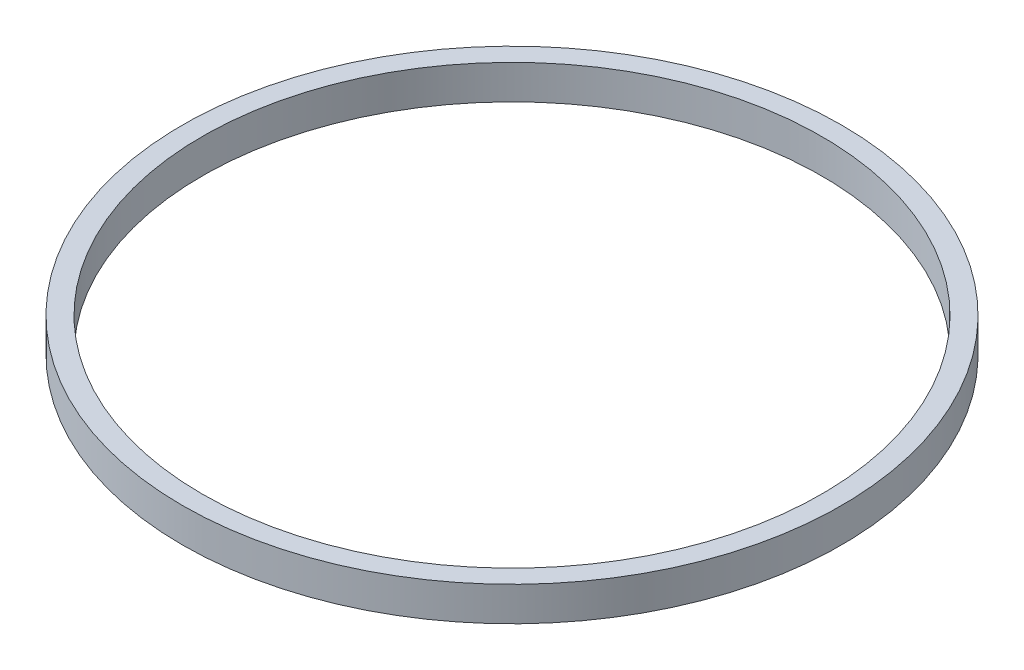
ISO-10303-21;
HEADER;
FILE_DESCRIPTION(('STEP AP214'),'2;1');
FILE_NAME('part.step','',(''),(''),'','','');
FILE_SCHEMA(('AUTOMOTIVE_DESIGN { 1 0 10303 214 1 1 1 1 }'));
ENDSEC;
DATA;
#1=APPLICATION_CONTEXT('core data for automotive mechanical design processes');
#2=APPLICATION_PROTOCOL_DEFINITION('international standard','automotive_design',2000,#1);
#3=PRODUCT_CONTEXT('',#1,'mechanical');
#4=PRODUCT('Part','Part','',(#3));
#5=PRODUCT_RELATED_PRODUCT_CATEGORY('part','',(#4));
#6=PRODUCT_DEFINITION_FORMATION('','',#4);
#7=PRODUCT_DEFINITION_CONTEXT('part definition',#1,'design');
#8=PRODUCT_DEFINITION('design','',#6,#7);
#9=PRODUCT_DEFINITION_SHAPE('','',#8);
#10=(LENGTH_UNIT() NAMED_UNIT(*) SI_UNIT(.MILLI.,.METRE.));
#11=(NAMED_UNIT(*) PLANE_ANGLE_UNIT() SI_UNIT($,.RADIAN.));
#12=(NAMED_UNIT(*) SI_UNIT($,.STERADIAN.) SOLID_ANGLE_UNIT());
#13=UNCERTAINTY_MEASURE_WITH_UNIT(LENGTH_MEASURE(1.E-05),#10,'distance_accuracy_value','');
#14=(GEOMETRIC_REPRESENTATION_CONTEXT(3) GLOBAL_UNCERTAINTY_ASSIGNED_CONTEXT((#13)) GLOBAL_UNIT_ASSIGNED_CONTEXT((#10,
#11,#12)) REPRESENTATION_CONTEXT('',''));
#15=CARTESIAN_POINT('',(0.,0.,0.));
#16=DIRECTION('',(0.,0.,1.));
#17=DIRECTION('',(1.,0.,0.));
#18=AXIS2_PLACEMENT_3D('',#15,#16,#17);
#19=CARTESIAN_POINT('',(0.,9.5,0.));
#20=DIRECTION('',(0.,1.,0.));
#21=DIRECTION('',(0.,0.,1.));
#22=AXIS2_PLACEMENT_3D('',#19,#20,#21);
#23=PLANE('',#22);
#24=CARTESIAN_POINT('',(0.,9.5,0.));
#25=DIRECTION('',(0.,1.,0.));
#26=DIRECTION('',(0.,0.,1.));
#27=AXIS2_PLACEMENT_3D('',#24,#25,#26);
#28=CIRCLE('',#27,183.);
#29=CARTESIAN_POINT('',(0.,9.5,183.));
#30=VERTEX_POINT('',#29);
#31=EDGE_CURVE('E10',#30,#30,#28,.T.);
#32=ORIENTED_EDGE('',*,*,#31,.T.);
#33=EDGE_LOOP('',(#32));
#34=FACE_BOUND('',#33,.T.);
#35=CARTESIAN_POINT('',(0.,9.5,0.));
#36=DIRECTION('',(0.,1.,0.));
#37=DIRECTION('',(0.,0.,1.));
#38=AXIS2_PLACEMENT_3D('',#35,#36,#37);
#39=CIRCLE('',#38,172.);
#40=CARTESIAN_POINT('',(0.,9.5,172.));
#41=VERTEX_POINT('',#40);
#42=EDGE_CURVE('E54',#41,#41,#39,.T.);
#43=ORIENTED_EDGE('',*,*,#42,.F.);
#44=EDGE_LOOP('',(#43));
#45=FACE_BOUND('',#44,.T.);
#46=ADVANCED_FACE('F39',(#34,#45),#23,.T.);
#47=CARTESIAN_POINT('',(0.,-9.5,0.));
#48=DIRECTION('',(0.,1.,0.));
#49=DIRECTION('',(0.,0.,1.));
#50=AXIS2_PLACEMENT_3D('',#47,#48,#49);
#51=PLANE('',#50);
#52=CARTESIAN_POINT('',(0.,-9.5,0.));
#53=DIRECTION('',(0.,1.,0.));
#54=DIRECTION('',(0.,0.,1.));
#55=AXIS2_PLACEMENT_3D('',#52,#53,#54);
#56=CIRCLE('',#55,183.);
#57=CARTESIAN_POINT('',(0.,-9.5,183.));
#58=VERTEX_POINT('',#57);
#59=EDGE_CURVE('E43',#58,#58,#56,.T.);
#60=ORIENTED_EDGE('',*,*,#59,.F.);
#61=EDGE_LOOP('',(#60));
#62=FACE_BOUND('',#61,.T.);
#63=CARTESIAN_POINT('',(0.,-9.5,0.));
#64=DIRECTION('',(0.,1.,0.));
#65=DIRECTION('',(0.,0.,1.));
#66=AXIS2_PLACEMENT_3D('',#63,#64,#65);
#67=CIRCLE('',#66,172.);
#68=CARTESIAN_POINT('',(0.,-9.5,172.));
#69=VERTEX_POINT('',#68);
#70=EDGE_CURVE('E56',#69,#69,#67,.T.);
#71=ORIENTED_EDGE('',*,*,#70,.T.);
#72=EDGE_LOOP('',(#71));
#73=FACE_BOUND('',#72,.T.);
#74=ADVANCED_FACE('F70',(#62,#73),#51,.F.);
#75=CARTESIAN_POINT('',(0.,9.5,0.));
#76=DIRECTION('',(0.,-1.,0.));
#77=DIRECTION('',(0.,0.,-1.));
#78=AXIS2_PLACEMENT_3D('',#75,#76,#77);
#79=CYLINDRICAL_SURFACE('',#78,183.);
#80=ORIENTED_EDGE('',*,*,#31,.F.);
#81=EDGE_LOOP('',(#80));
#82=FACE_BOUND('',#81,.T.);
#83=ORIENTED_EDGE('',*,*,#59,.T.);
#84=EDGE_LOOP('',(#83));
#85=FACE_BOUND('',#84,.T.);
#86=ADVANCED_FACE('F41',(#82,#85),#79,.T.);
#87=CARTESIAN_POINT('',(0.,9.5,0.));
#88=DIRECTION('',(0.,-1.,0.));
#89=DIRECTION('',(0.,0.,-1.));
#90=AXIS2_PLACEMENT_3D('',#87,#88,#89);
#91=CYLINDRICAL_SURFACE('',#90,172.);
#92=ORIENTED_EDGE('',*,*,#42,.T.);
#93=EDGE_LOOP('',(#92));
#94=FACE_BOUND('',#93,.T.);
#95=ORIENTED_EDGE('',*,*,#70,.F.);
#96=EDGE_LOOP('',(#95));
#97=FACE_BOUND('',#96,.T.);
#98=ADVANCED_FACE('F66',(#94,#97),#91,.F.);
#99=CLOSED_SHELL('',(#46,#74,#86,#98));
#100=MANIFOLD_SOLID_BREP('B2',#99);
#101=ADVANCED_BREP_SHAPE_REPRESENTATION('',(#18,#100),#14);
#102=SHAPE_DEFINITION_REPRESENTATION(#9,#101);
ENDSEC;
END-ISO-10303-21;
